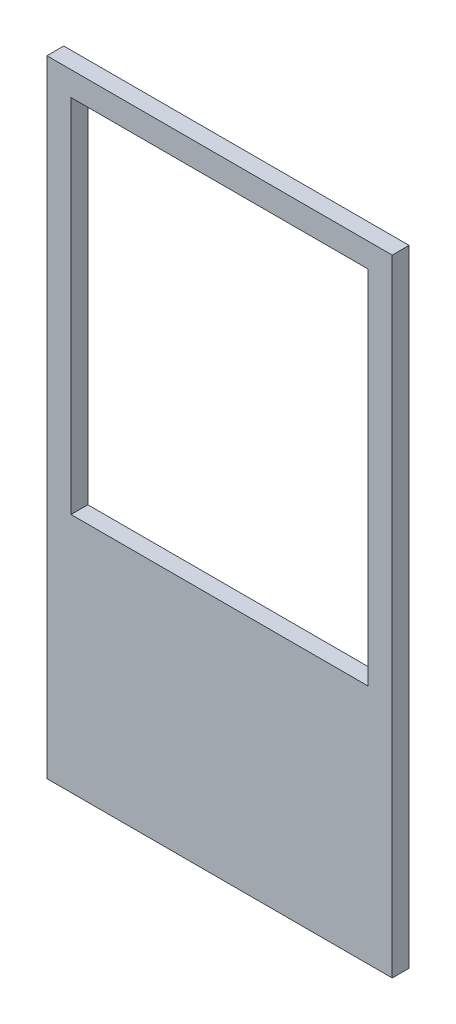
ISO-10303-21;
HEADER;
FILE_DESCRIPTION(('STEP AP214'),'2;1');
FILE_NAME('part.step','',(''),(''),'','','');
FILE_SCHEMA(('AUTOMOTIVE_DESIGN { 1 0 10303 214 1 1 1 1 }'));
ENDSEC;
DATA;
#1=APPLICATION_CONTEXT('core data for automotive mechanical design processes');
#2=APPLICATION_PROTOCOL_DEFINITION('international standard','automotive_design',2000,#1);
#3=PRODUCT_CONTEXT('',#1,'mechanical');
#4=PRODUCT('Part','Part','',(#3));
#5=PRODUCT_RELATED_PRODUCT_CATEGORY('part','',(#4));
#6=PRODUCT_DEFINITION_FORMATION('','',#4);
#7=PRODUCT_DEFINITION_CONTEXT('part definition',#1,'design');
#8=PRODUCT_DEFINITION('design','',#6,#7);
#9=PRODUCT_DEFINITION_SHAPE('','',#8);
#10=(LENGTH_UNIT() NAMED_UNIT(*) SI_UNIT(.MILLI.,.METRE.));
#11=(NAMED_UNIT(*) PLANE_ANGLE_UNIT() SI_UNIT($,.RADIAN.));
#12=(NAMED_UNIT(*) SI_UNIT($,.STERADIAN.) SOLID_ANGLE_UNIT());
#13=UNCERTAINTY_MEASURE_WITH_UNIT(LENGTH_MEASURE(1.E-05),#10,'distance_accuracy_value','');
#14=(GEOMETRIC_REPRESENTATION_CONTEXT(3) GLOBAL_UNCERTAINTY_ASSIGNED_CONTEXT((#13)) GLOBAL_UNIT_ASSIGNED_CONTEXT((#10,
#11,#12)) REPRESENTATION_CONTEXT('',''));
#15=CARTESIAN_POINT('',(0.,0.,0.));
#16=DIRECTION('',(0.,0.,1.));
#17=DIRECTION('',(1.,0.,0.));
#18=AXIS2_PLACEMENT_3D('',#15,#16,#17);
#19=CARTESIAN_POINT('',(0.,-300.,70.));
#20=DIRECTION('',(0.,-1.,0.));
#21=DIRECTION('',(1.,0.,0.));
#22=AXIS2_PLACEMENT_3D('',#19,#20,#21);
#23=PLANE('',#22);
#24=DIRECTION('',(-1.,0.,0.));
#25=VECTOR('',#24,1.);
#26=CARTESIAN_POINT('',(0.,-300.,0.));
#27=LINE('',#26,#25);
#28=CARTESIAN_POINT('',(617.01,-300.,0.));
#29=VERTEX_POINT('',#28);
#30=CARTESIAN_POINT('',(-617.01,-300.000000000001,0.));
#31=VERTEX_POINT('',#30);
#32=EDGE_CURVE('E142',#29,#31,#27,.T.);
#33=ORIENTED_EDGE('',*,*,#32,.T.);
#34=DIRECTION('',(0.,0.,-1.));
#35=VECTOR('',#34,1.);
#36=CARTESIAN_POINT('',(-617.01,-300.000000000001,70.));
#37=LINE('',#36,#35);
#38=CARTESIAN_POINT('',(-617.01,-300.000000000001,70.));
#39=VERTEX_POINT('',#38);
#40=EDGE_CURVE('E11',#39,#31,#37,.T.);
#41=ORIENTED_EDGE('',*,*,#40,.F.);
#42=DIRECTION('',(-1.,0.,0.));
#43=VECTOR('',#42,1.);
#44=CARTESIAN_POINT('',(0.,-300.,70.));
#45=LINE('',#44,#43);
#46=CARTESIAN_POINT('',(617.01,-300.,70.));
#47=VERTEX_POINT('',#46);
#48=EDGE_CURVE('E117',#47,#39,#45,.T.);
#49=ORIENTED_EDGE('',*,*,#48,.F.);
#50=DIRECTION('',(0.,0.,-1.));
#51=VECTOR('',#50,1.);
#52=CARTESIAN_POINT('',(617.01,-300.,70.));
#53=LINE('',#52,#51);
#54=EDGE_CURVE('E149',#47,#29,#53,.T.);
#55=ORIENTED_EDGE('',*,*,#54,.T.);
#56=EDGE_LOOP('',(#33,#41,#49,#55));
#57=FACE_BOUND('',#56,.T.);
#58=ADVANCED_FACE('F36',(#57),#23,.F.);
#59=CARTESIAN_POINT('',(-617.01,0.,70.));
#60=DIRECTION('',(-1.,0.,0.));
#61=DIRECTION('',(0.,0.,1.));
#62=AXIS2_PLACEMENT_3D('',#59,#60,#61);
#63=PLANE('',#62);
#64=DIRECTION('',(0.,1.,0.));
#65=VECTOR('',#64,1.);
#66=CARTESIAN_POINT('',(-617.01,0.,0.));
#67=LINE('',#66,#65);
#68=CARTESIAN_POINT('',(-617.01,1199.72,0.));
#69=VERTEX_POINT('',#68);
#70=EDGE_CURVE('E122',#31,#69,#67,.T.);
#71=ORIENTED_EDGE('',*,*,#70,.T.);
#72=DIRECTION('',(0.,0.,-1.));
#73=VECTOR('',#72,1.);
#74=CARTESIAN_POINT('',(-617.01,1199.72,70.));
#75=LINE('',#74,#73);
#76=CARTESIAN_POINT('',(-617.01,1199.72,70.));
#77=VERTEX_POINT('',#76);
#78=EDGE_CURVE('E46',#77,#69,#75,.T.);
#79=ORIENTED_EDGE('',*,*,#78,.F.);
#80=DIRECTION('',(0.,1.,0.));
#81=VECTOR('',#80,1.);
#82=CARTESIAN_POINT('',(-617.01,0.,70.));
#83=LINE('',#82,#81);
#84=EDGE_CURVE('E111',#39,#77,#83,.T.);
#85=ORIENTED_EDGE('',*,*,#84,.F.);
#86=ORIENTED_EDGE('',*,*,#40,.T.);
#87=EDGE_LOOP('',(#71,#79,#85,#86));
#88=FACE_BOUND('',#87,.T.);
#89=ADVANCED_FACE('F121',(#88),#63,.F.);
#90=CARTESIAN_POINT('',(0.,1199.72,70.));
#91=DIRECTION('',(0.,1.,0.));
#92=DIRECTION('',(0.,0.,1.));
#93=AXIS2_PLACEMENT_3D('',#90,#91,#92);
#94=PLANE('',#93);
#95=DIRECTION('',(1.,0.,0.));
#96=VECTOR('',#95,1.);
#97=CARTESIAN_POINT('',(0.,1199.72,0.));
#98=LINE('',#97,#96);
#99=CARTESIAN_POINT('',(617.01,1199.72,0.));
#100=VERTEX_POINT('',#99);
#101=EDGE_CURVE('E84',#69,#100,#98,.T.);
#102=ORIENTED_EDGE('',*,*,#101,.T.);
#103=DIRECTION('',(0.,0.,-1.));
#104=VECTOR('',#103,1.);
#105=CARTESIAN_POINT('',(617.01,1199.72,70.));
#106=LINE('',#105,#104);
#107=CARTESIAN_POINT('',(617.01,1199.72,70.));
#108=VERTEX_POINT('',#107);
#109=EDGE_CURVE('E123',#108,#100,#106,.T.);
#110=ORIENTED_EDGE('',*,*,#109,.F.);
#111=DIRECTION('',(1.,0.,0.));
#112=VECTOR('',#111,1.);
#113=CARTESIAN_POINT('',(0.,1199.72,70.));
#114=LINE('',#113,#112);
#115=EDGE_CURVE('E115',#77,#108,#114,.T.);
#116=ORIENTED_EDGE('',*,*,#115,.F.);
#117=ORIENTED_EDGE('',*,*,#78,.T.);
#118=EDGE_LOOP('',(#102,#110,#116,#117));
#119=FACE_BOUND('',#118,.T.);
#120=ADVANCED_FACE('F125',(#119),#94,.F.);
#121=CARTESIAN_POINT('',(-717.01,0.,70.));
#122=DIRECTION('',(-1.,0.,0.));
#123=DIRECTION('',(0.,-1.,0.));
#124=AXIS2_PLACEMENT_3D('',#121,#122,#123);
#125=PLANE('',#124);
#126=DIRECTION('',(0.,1.,0.));
#127=VECTOR('',#126,1.);
#128=CARTESIAN_POINT('',(-717.01,0.,0.));
#129=LINE('',#128,#127);
#130=CARTESIAN_POINT('',(-717.01,-1300.,0.));
#131=VERTEX_POINT('',#130);
#132=CARTESIAN_POINT('',(-717.01,1300.,0.));
#133=VERTEX_POINT('',#132);
#134=EDGE_CURVE('E131',#131,#133,#129,.T.);
#135=ORIENTED_EDGE('',*,*,#134,.F.);
#136=DIRECTION('',(0.,0.,-1.));
#137=VECTOR('',#136,1.);
#138=CARTESIAN_POINT('',(-717.01,-1300.,70.));
#139=LINE('',#138,#137);
#140=CARTESIAN_POINT('',(-717.01,-1300.,70.));
#141=VERTEX_POINT('',#140);
#142=EDGE_CURVE('E40',#141,#131,#139,.T.);
#143=ORIENTED_EDGE('',*,*,#142,.F.);
#144=DIRECTION('',(0.,1.,0.));
#145=VECTOR('',#144,1.);
#146=CARTESIAN_POINT('',(-717.01,0.,70.));
#147=LINE('',#146,#145);
#148=CARTESIAN_POINT('',(-717.01,1300.,70.));
#149=VERTEX_POINT('',#148);
#150=EDGE_CURVE('E148',#141,#149,#147,.T.);
#151=ORIENTED_EDGE('',*,*,#150,.T.);
#152=DIRECTION('',(0.,0.,-1.));
#153=VECTOR('',#152,1.);
#154=CARTESIAN_POINT('',(-717.01,1300.,70.));
#155=LINE('',#154,#153);
#156=EDGE_CURVE('E127',#149,#133,#155,.T.);
#157=ORIENTED_EDGE('',*,*,#156,.T.);
#158=EDGE_LOOP('',(#135,#143,#151,#157));
#159=FACE_BOUND('',#158,.T.);
#160=ADVANCED_FACE('F38',(#159),#125,.T.);
#161=CARTESIAN_POINT('',(2.01292859515586E-13,-1300.,70.));
#162=DIRECTION('',(0.,-1.,0.));
#163=DIRECTION('',(1.,0.,0.));
#164=AXIS2_PLACEMENT_3D('',#161,#162,#163);
#165=PLANE('',#164);
#166=DIRECTION('',(-1.,0.,0.));
#167=VECTOR('',#166,1.);
#168=CARTESIAN_POINT('',(2.01292859515586E-13,-1300.,0.));
#169=LINE('',#168,#167);
#170=CARTESIAN_POINT('',(717.01,-1300.,0.));
#171=VERTEX_POINT('',#170);
#172=EDGE_CURVE('E134',#171,#131,#169,.T.);
#173=ORIENTED_EDGE('',*,*,#172,.F.);
#174=DIRECTION('',(0.,0.,-1.));
#175=VECTOR('',#174,1.);
#176=CARTESIAN_POINT('',(717.01,-1300.,70.));
#177=LINE('',#176,#175);
#178=CARTESIAN_POINT('',(717.01,-1300.,70.));
#179=VERTEX_POINT('',#178);
#180=EDGE_CURVE('E155',#179,#171,#177,.T.);
#181=ORIENTED_EDGE('',*,*,#180,.F.);
#182=DIRECTION('',(-1.,0.,0.));
#183=VECTOR('',#182,1.);
#184=CARTESIAN_POINT('',(2.01292859515586E-13,-1300.,70.));
#185=LINE('',#184,#183);
#186=EDGE_CURVE('E164',#179,#141,#185,.T.);
#187=ORIENTED_EDGE('',*,*,#186,.T.);
#188=ORIENTED_EDGE('',*,*,#142,.T.);
#189=EDGE_LOOP('',(#173,#181,#187,#188));
#190=FACE_BOUND('',#189,.T.);
#191=ADVANCED_FACE('F162',(#190),#165,.T.);
#192=CARTESIAN_POINT('',(717.01,0.,70.));
#193=DIRECTION('',(-1.,0.,0.));
#194=DIRECTION('',(0.,0.,1.));
#195=AXIS2_PLACEMENT_3D('',#192,#193,#194);
#196=PLANE('',#195);
#197=DIRECTION('',(0.,1.,0.));
#198=VECTOR('',#197,1.);
#199=CARTESIAN_POINT('',(717.01,0.,0.));
#200=LINE('',#199,#198);
#201=CARTESIAN_POINT('',(717.01,1300.,0.));
#202=VERTEX_POINT('',#201);
#203=EDGE_CURVE('E137',#171,#202,#200,.T.);
#204=ORIENTED_EDGE('',*,*,#203,.T.);
#205=DIRECTION('',(0.,0.,-1.));
#206=VECTOR('',#205,1.);
#207=CARTESIAN_POINT('',(717.01,1300.,70.));
#208=LINE('',#207,#206);
#209=CARTESIAN_POINT('',(717.01,1300.,70.));
#210=VERTEX_POINT('',#209);
#211=EDGE_CURVE('E153',#210,#202,#208,.T.);
#212=ORIENTED_EDGE('',*,*,#211,.F.);
#213=DIRECTION('',(0.,1.,0.));
#214=VECTOR('',#213,1.);
#215=CARTESIAN_POINT('',(717.01,0.,70.));
#216=LINE('',#215,#214);
#217=EDGE_CURVE('E177',#179,#210,#216,.T.);
#218=ORIENTED_EDGE('',*,*,#217,.F.);
#219=ORIENTED_EDGE('',*,*,#180,.T.);
#220=EDGE_LOOP('',(#204,#212,#218,#219));
#221=FACE_BOUND('',#220,.T.);
#222=ADVANCED_FACE('F171',(#221),#196,.F.);
#223=CARTESIAN_POINT('',(-2.01292859515586E-13,1300.,70.));
#224=DIRECTION('',(0.,-1.,0.));
#225=DIRECTION('',(1.,0.,0.));
#226=AXIS2_PLACEMENT_3D('',#223,#224,#225);
#227=PLANE('',#226);
#228=DIRECTION('',(-1.,0.,0.));
#229=VECTOR('',#228,1.);
#230=CARTESIAN_POINT('',(-2.01292859515586E-13,1300.,0.));
#231=LINE('',#230,#229);
#232=EDGE_CURVE('E139',#202,#133,#231,.T.);
#233=ORIENTED_EDGE('',*,*,#232,.T.);
#234=ORIENTED_EDGE('',*,*,#156,.F.);
#235=DIRECTION('',(-1.,0.,0.));
#236=VECTOR('',#235,1.);
#237=CARTESIAN_POINT('',(-2.01292859515586E-13,1300.,70.));
#238=LINE('',#237,#236);
#239=EDGE_CURVE('E175',#210,#149,#238,.T.);
#240=ORIENTED_EDGE('',*,*,#239,.F.);
#241=ORIENTED_EDGE('',*,*,#211,.T.);
#242=EDGE_LOOP('',(#233,#234,#240,#241));
#243=FACE_BOUND('',#242,.T.);
#244=ADVANCED_FACE('F174',(#243),#227,.F.);
#245=CARTESIAN_POINT('',(617.01,0.,70.));
#246=DIRECTION('',(1.,0.,0.));
#247=DIRECTION('',(0.,1.,0.));
#248=AXIS2_PLACEMENT_3D('',#245,#246,#247);
#249=PLANE('',#248);
#250=DIRECTION('',(0.,-1.,0.));
#251=VECTOR('',#250,1.);
#252=CARTESIAN_POINT('',(617.01,0.,0.));
#253=LINE('',#252,#251);
#254=EDGE_CURVE('E90',#100,#29,#253,.T.);
#255=ORIENTED_EDGE('',*,*,#254,.T.);
#256=ORIENTED_EDGE('',*,*,#54,.F.);
#257=DIRECTION('',(0.,-1.,0.));
#258=VECTOR('',#257,1.);
#259=CARTESIAN_POINT('',(617.01,0.,70.));
#260=LINE('',#259,#258);
#261=EDGE_CURVE('E55',#108,#47,#260,.T.);
#262=ORIENTED_EDGE('',*,*,#261,.F.);
#263=ORIENTED_EDGE('',*,*,#109,.T.);
#264=EDGE_LOOP('',(#255,#256,#262,#263));
#265=FACE_BOUND('',#264,.T.);
#266=ADVANCED_FACE('F183',(#265),#249,.F.);
#267=CARTESIAN_POINT('',(0.,0.,70.));
#268=DIRECTION('',(0.,0.,1.));
#269=DIRECTION('',(1.,0.,0.));
#270=AXIS2_PLACEMENT_3D('',#267,#268,#269);
#271=PLANE('',#270);
#272=ORIENTED_EDGE('',*,*,#150,.F.);
#273=ORIENTED_EDGE('',*,*,#186,.F.);
#274=ORIENTED_EDGE('',*,*,#217,.T.);
#275=ORIENTED_EDGE('',*,*,#239,.T.);
#276=EDGE_LOOP('',(#272,#273,#274,#275));
#277=FACE_BOUND('',#276,.T.);
#278=ORIENTED_EDGE('',*,*,#48,.T.);
#279=ORIENTED_EDGE('',*,*,#84,.T.);
#280=ORIENTED_EDGE('',*,*,#115,.T.);
#281=ORIENTED_EDGE('',*,*,#261,.T.);
#282=EDGE_LOOP('',(#278,#279,#280,#281));
#283=FACE_BOUND('',#282,.T.);
#284=ADVANCED_FACE('F113',(#277,#283),#271,.T.);
#285=CARTESIAN_POINT('',(0.,0.,0.));
#286=DIRECTION('',(0.,0.,1.));
#287=DIRECTION('',(1.,0.,0.));
#288=AXIS2_PLACEMENT_3D('',#285,#286,#287);
#289=PLANE('',#288);
#290=ORIENTED_EDGE('',*,*,#134,.T.);
#291=ORIENTED_EDGE('',*,*,#232,.F.);
#292=ORIENTED_EDGE('',*,*,#203,.F.);
#293=ORIENTED_EDGE('',*,*,#172,.T.);
#294=EDGE_LOOP('',(#290,#291,#292,#293));
#295=FACE_BOUND('',#294,.T.);
#296=ORIENTED_EDGE('',*,*,#32,.F.);
#297=ORIENTED_EDGE('',*,*,#254,.F.);
#298=ORIENTED_EDGE('',*,*,#101,.F.);
#299=ORIENTED_EDGE('',*,*,#70,.F.);
#300=EDGE_LOOP('',(#296,#297,#298,#299));
#301=FACE_BOUND('',#300,.T.);
#302=ADVANCED_FACE('F168',(#295,#301),#289,.F.);
#303=CLOSED_SHELL('',(#58,#89,#120,#160,#191,#222,#244,#266,#284,#302));
#304=MANIFOLD_SOLID_BREP('B2',#303);
#305=ADVANCED_BREP_SHAPE_REPRESENTATION('',(#18,#304),#14);
#306=SHAPE_DEFINITION_REPRESENTATION(#9,#305);
ENDSEC;
END-ISO-10303-21;
